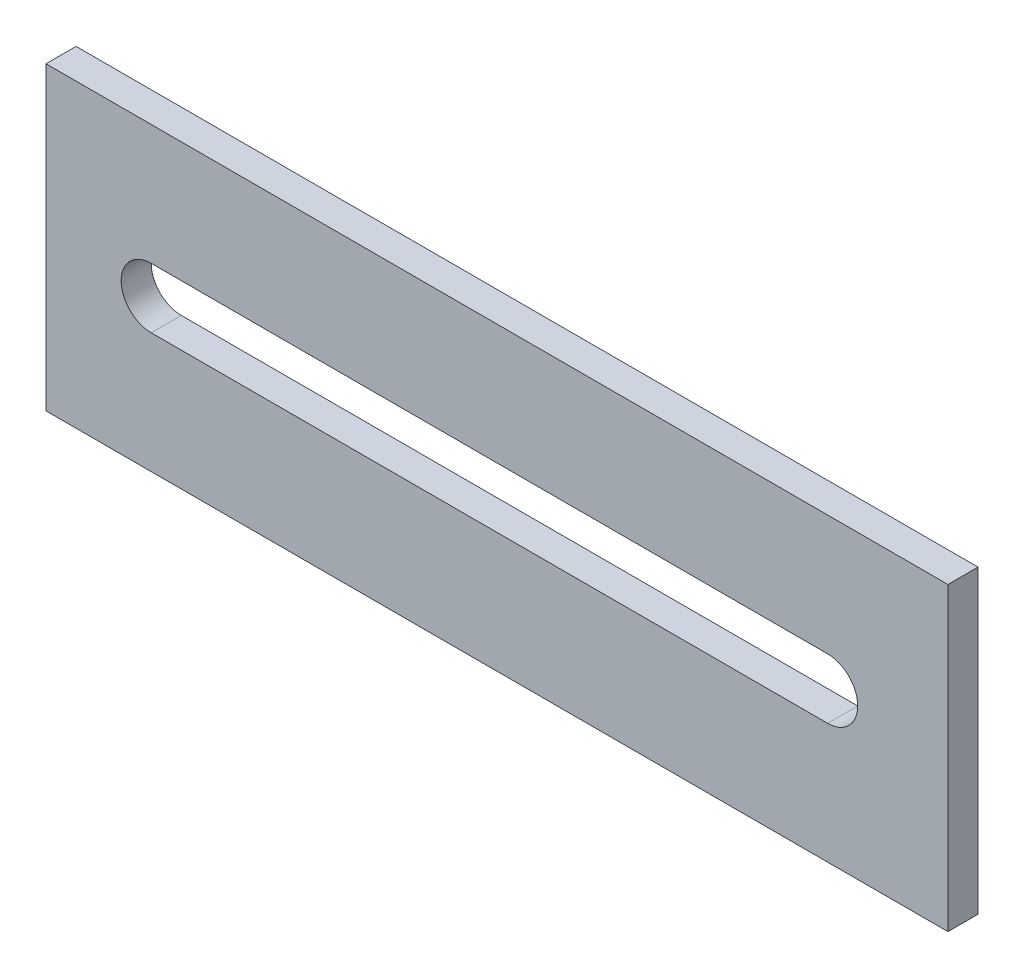
ISO-10303-21;
HEADER;
FILE_DESCRIPTION(('STEP AP214'),'2;1');
FILE_NAME('part.step','',(''),(''),'','','');
FILE_SCHEMA(('AUTOMOTIVE_DESIGN { 1 0 10303 214 1 1 1 1 }'));
ENDSEC;
DATA;
#1=APPLICATION_CONTEXT('core data for automotive mechanical design processes');
#2=APPLICATION_PROTOCOL_DEFINITION('international standard','automotive_design',2000,#1);
#3=PRODUCT_CONTEXT('',#1,'mechanical');
#4=PRODUCT('Part','Part','',(#3));
#5=PRODUCT_RELATED_PRODUCT_CATEGORY('part','',(#4));
#6=PRODUCT_DEFINITION_FORMATION('','',#4);
#7=PRODUCT_DEFINITION_CONTEXT('part definition',#1,'design');
#8=PRODUCT_DEFINITION('design','',#6,#7);
#9=PRODUCT_DEFINITION_SHAPE('','',#8);
#10=(LENGTH_UNIT() NAMED_UNIT(*) SI_UNIT(.MILLI.,.METRE.));
#11=(NAMED_UNIT(*) PLANE_ANGLE_UNIT() SI_UNIT($,.RADIAN.));
#12=(NAMED_UNIT(*) SI_UNIT($,.STERADIAN.) SOLID_ANGLE_UNIT());
#13=UNCERTAINTY_MEASURE_WITH_UNIT(LENGTH_MEASURE(1.E-05),#10,'distance_accuracy_value','');
#14=(GEOMETRIC_REPRESENTATION_CONTEXT(3) GLOBAL_UNCERTAINTY_ASSIGNED_CONTEXT((#13)) GLOBAL_UNIT_ASSIGNED_CONTEXT((#10,
#11,#12)) REPRESENTATION_CONTEXT('',''));
#15=CARTESIAN_POINT('',(0.,0.,0.));
#16=DIRECTION('',(0.,0.,1.));
#17=DIRECTION('',(1.,0.,0.));
#18=AXIS2_PLACEMENT_3D('',#15,#16,#17);
#19=CARTESIAN_POINT('',(30.,10.,2.));
#20=DIRECTION('',(-1.,0.,0.));
#21=DIRECTION('',(0.,0.,1.));
#22=AXIS2_PLACEMENT_3D('',#19,#20,#21);
#23=PLANE('',#22);
#24=DIRECTION('',(0.,1.,0.));
#25=VECTOR('',#24,1.);
#26=CARTESIAN_POINT('',(30.,10.,0.));
#27=LINE('',#26,#25);
#28=CARTESIAN_POINT('',(30.,-10.,0.));
#29=VERTEX_POINT('',#28);
#30=CARTESIAN_POINT('',(30.,10.,0.));
#31=VERTEX_POINT('',#30);
#32=EDGE_CURVE('E133',#29,#31,#27,.T.);
#33=ORIENTED_EDGE('',*,*,#32,.T.);
#34=DIRECTION('',(0.,0.,-1.));
#35=VECTOR('',#34,1.);
#36=CARTESIAN_POINT('',(30.,10.,2.));
#37=LINE('',#36,#35);
#38=CARTESIAN_POINT('',(30.,10.,2.));
#39=VERTEX_POINT('',#38);
#40=EDGE_CURVE('E11',#39,#31,#37,.T.);
#41=ORIENTED_EDGE('',*,*,#40,.F.);
#42=DIRECTION('',(0.,1.,0.));
#43=VECTOR('',#42,1.);
#44=CARTESIAN_POINT('',(30.,10.,2.));
#45=LINE('',#44,#43);
#46=CARTESIAN_POINT('',(30.,-10.,2.));
#47=VERTEX_POINT('',#46);
#48=EDGE_CURVE('E137',#47,#39,#45,.T.);
#49=ORIENTED_EDGE('',*,*,#48,.F.);
#50=DIRECTION('',(0.,0.,-1.));
#51=VECTOR('',#50,1.);
#52=CARTESIAN_POINT('',(30.,-10.,2.));
#53=LINE('',#52,#51);
#54=EDGE_CURVE('E147',#47,#29,#53,.T.);
#55=ORIENTED_EDGE('',*,*,#54,.T.);
#56=EDGE_LOOP('',(#33,#41,#49,#55));
#57=FACE_BOUND('',#56,.T.);
#58=ADVANCED_FACE('F36',(#57),#23,.F.);
#59=CARTESIAN_POINT('',(-30.,10.,2.));
#60=DIRECTION('',(0.,-1.,0.));
#61=DIRECTION('',(0.,0.,-1.));
#62=AXIS2_PLACEMENT_3D('',#59,#60,#61);
#63=PLANE('',#62);
#64=DIRECTION('',(-1.,0.,0.));
#65=VECTOR('',#64,1.);
#66=CARTESIAN_POINT('',(-30.,10.,0.));
#67=LINE('',#66,#65);
#68=CARTESIAN_POINT('',(-30.,10.,0.));
#69=VERTEX_POINT('',#68);
#70=EDGE_CURVE('E150',#31,#69,#67,.T.);
#71=ORIENTED_EDGE('',*,*,#70,.T.);
#72=DIRECTION('',(0.,0.,-1.));
#73=VECTOR('',#72,1.);
#74=CARTESIAN_POINT('',(-30.,10.,2.));
#75=LINE('',#74,#73);
#76=CARTESIAN_POINT('',(-30.,10.,2.));
#77=VERTEX_POINT('',#76);
#78=EDGE_CURVE('E43',#77,#69,#75,.T.);
#79=ORIENTED_EDGE('',*,*,#78,.F.);
#80=DIRECTION('',(-1.,0.,0.));
#81=VECTOR('',#80,1.);
#82=CARTESIAN_POINT('',(-30.,10.,2.));
#83=LINE('',#82,#81);
#84=EDGE_CURVE('E140',#39,#77,#83,.T.);
#85=ORIENTED_EDGE('',*,*,#84,.F.);
#86=ORIENTED_EDGE('',*,*,#40,.T.);
#87=EDGE_LOOP('',(#71,#79,#85,#86));
#88=FACE_BOUND('',#87,.T.);
#89=ADVANCED_FACE('F178',(#88),#63,.F.);
#90=CARTESIAN_POINT('',(-30.,10.,2.));
#91=DIRECTION('',(1.,0.,0.));
#92=DIRECTION('',(0.,1.,0.));
#93=AXIS2_PLACEMENT_3D('',#90,#91,#92);
#94=PLANE('',#93);
#95=DIRECTION('',(0.,-1.,0.));
#96=VECTOR('',#95,1.);
#97=CARTESIAN_POINT('',(-30.,10.,0.));
#98=LINE('',#97,#96);
#99=CARTESIAN_POINT('',(-30.,-10.,0.));
#100=VERTEX_POINT('',#99);
#101=EDGE_CURVE('E152',#69,#100,#98,.T.);
#102=ORIENTED_EDGE('',*,*,#101,.T.);
#103=DIRECTION('',(0.,0.,-1.));
#104=VECTOR('',#103,1.);
#105=CARTESIAN_POINT('',(-30.,-10.,2.));
#106=LINE('',#105,#104);
#107=CARTESIAN_POINT('',(-30.,-10.,2.));
#108=VERTEX_POINT('',#107);
#109=EDGE_CURVE('E157',#108,#100,#106,.T.);
#110=ORIENTED_EDGE('',*,*,#109,.F.);
#111=DIRECTION('',(0.,-1.,0.));
#112=VECTOR('',#111,1.);
#113=CARTESIAN_POINT('',(-30.,10.,2.));
#114=LINE('',#113,#112);
#115=EDGE_CURVE('E143',#77,#108,#114,.T.);
#116=ORIENTED_EDGE('',*,*,#115,.F.);
#117=ORIENTED_EDGE('',*,*,#78,.T.);
#118=EDGE_LOOP('',(#102,#110,#116,#117));
#119=FACE_BOUND('',#118,.T.);
#120=ADVANCED_FACE('F164',(#119),#94,.F.);
#121=CARTESIAN_POINT('',(-30.,-10.,2.));
#122=DIRECTION('',(0.,1.,0.));
#123=DIRECTION('',(0.,0.,1.));
#124=AXIS2_PLACEMENT_3D('',#121,#122,#123);
#125=PLANE('',#124);
#126=DIRECTION('',(1.,0.,0.));
#127=VECTOR('',#126,1.);
#128=CARTESIAN_POINT('',(-30.,-10.,0.));
#129=LINE('',#128,#127);
#130=EDGE_CURVE('E141',#100,#29,#129,.T.);
#131=ORIENTED_EDGE('',*,*,#130,.T.);
#132=ORIENTED_EDGE('',*,*,#54,.F.);
#133=DIRECTION('',(1.,0.,0.));
#134=VECTOR('',#133,1.);
#135=CARTESIAN_POINT('',(-30.,-10.,2.));
#136=LINE('',#135,#134);
#137=EDGE_CURVE('E145',#108,#47,#136,.T.);
#138=ORIENTED_EDGE('',*,*,#137,.F.);
#139=ORIENTED_EDGE('',*,*,#109,.T.);
#140=EDGE_LOOP('',(#131,#132,#138,#139));
#141=FACE_BOUND('',#140,.T.);
#142=ADVANCED_FACE('F171',(#141),#125,.F.);
#143=CARTESIAN_POINT('',(0.,0.,2.));
#144=DIRECTION('',(0.,0.,1.));
#145=DIRECTION('',(1.,0.,0.));
#146=AXIS2_PLACEMENT_3D('',#143,#144,#145);
#147=PLANE('',#146);
#148=CARTESIAN_POINT('',(-23.,0.,2.));
#149=DIRECTION('',(0.,0.,1.));
#150=DIRECTION('',(1.,0.,0.));
#151=AXIS2_PLACEMENT_3D('',#148,#149,#150);
#152=CIRCLE('',#151,2.);
#153=CARTESIAN_POINT('',(-23.,2.,2.));
#154=VERTEX_POINT('',#153);
#155=CARTESIAN_POINT('',(-23.,-2.,2.));
#156=VERTEX_POINT('',#155);
#157=EDGE_CURVE('E50',#154,#156,#152,.T.);
#158=ORIENTED_EDGE('',*,*,#157,.F.);
#159=DIRECTION('',(-1.,0.,0.));
#160=VECTOR('',#159,1.);
#161=CARTESIAN_POINT('',(-23.,2.,2.));
#162=LINE('',#161,#160);
#163=CARTESIAN_POINT('',(22.,2.,2.));
#164=VERTEX_POINT('',#163);
#165=EDGE_CURVE('E118',#164,#154,#162,.T.);
#166=ORIENTED_EDGE('',*,*,#165,.F.);
#167=CARTESIAN_POINT('',(22.,0.,2.));
#168=DIRECTION('',(0.,0.,1.));
#169=DIRECTION('',(1.,0.,0.));
#170=AXIS2_PLACEMENT_3D('',#167,#168,#169);
#171=CIRCLE('',#170,2.);
#172=CARTESIAN_POINT('',(22.,-2.,2.));
#173=VERTEX_POINT('',#172);
#174=EDGE_CURVE('E121',#173,#164,#171,.T.);
#175=ORIENTED_EDGE('',*,*,#174,.F.);
#176=DIRECTION('',(1.,0.,0.));
#177=VECTOR('',#176,1.);
#178=CARTESIAN_POINT('',(-23.,-2.,2.));
#179=LINE('',#178,#177);
#180=EDGE_CURVE('E127',#156,#173,#179,.T.);
#181=ORIENTED_EDGE('',*,*,#180,.F.);
#182=EDGE_LOOP('',(#158,#166,#175,#181));
#183=FACE_BOUND('',#182,.T.);
#184=ORIENTED_EDGE('',*,*,#48,.T.);
#185=ORIENTED_EDGE('',*,*,#84,.T.);
#186=ORIENTED_EDGE('',*,*,#115,.T.);
#187=ORIENTED_EDGE('',*,*,#137,.T.);
#188=EDGE_LOOP('',(#184,#185,#186,#187));
#189=FACE_BOUND('',#188,.T.);
#190=ADVANCED_FACE('F177',(#183,#189),#147,.T.);
#191=CARTESIAN_POINT('',(0.,0.,0.));
#192=DIRECTION('',(0.,0.,1.));
#193=DIRECTION('',(1.,0.,0.));
#194=AXIS2_PLACEMENT_3D('',#191,#192,#193);
#195=PLANE('',#194);
#196=DIRECTION('',(-1.,0.,0.));
#197=VECTOR('',#196,1.);
#198=CARTESIAN_POINT('',(-23.,2.,0.));
#199=LINE('',#198,#197);
#200=CARTESIAN_POINT('',(22.,2.,0.));
#201=VERTEX_POINT('',#200);
#202=CARTESIAN_POINT('',(-23.,2.,0.));
#203=VERTEX_POINT('',#202);
#204=EDGE_CURVE('E108',#201,#203,#199,.T.);
#205=ORIENTED_EDGE('',*,*,#204,.T.);
#206=CARTESIAN_POINT('',(-23.,0.,0.));
#207=DIRECTION('',(0.,0.,1.));
#208=DIRECTION('',(1.,0.,0.));
#209=AXIS2_PLACEMENT_3D('',#206,#207,#208);
#210=CIRCLE('',#209,2.);
#211=CARTESIAN_POINT('',(-23.,-2.,0.));
#212=VERTEX_POINT('',#211);
#213=EDGE_CURVE('E102',#203,#212,#210,.T.);
#214=ORIENTED_EDGE('',*,*,#213,.T.);
#215=DIRECTION('',(1.,0.,0.));
#216=VECTOR('',#215,1.);
#217=CARTESIAN_POINT('',(-23.,-2.,0.));
#218=LINE('',#217,#216);
#219=CARTESIAN_POINT('',(22.,-2.,0.));
#220=VERTEX_POINT('',#219);
#221=EDGE_CURVE('E111',#212,#220,#218,.T.);
#222=ORIENTED_EDGE('',*,*,#221,.T.);
#223=CARTESIAN_POINT('',(22.,0.,0.));
#224=DIRECTION('',(0.,0.,1.));
#225=DIRECTION('',(1.,0.,0.));
#226=AXIS2_PLACEMENT_3D('',#223,#224,#225);
#227=CIRCLE('',#226,2.);
#228=EDGE_CURVE('E58',#220,#201,#227,.T.);
#229=ORIENTED_EDGE('',*,*,#228,.T.);
#230=EDGE_LOOP('',(#205,#214,#222,#229));
#231=FACE_BOUND('',#230,.T.);
#232=ORIENTED_EDGE('',*,*,#32,.F.);
#233=ORIENTED_EDGE('',*,*,#130,.F.);
#234=ORIENTED_EDGE('',*,*,#101,.F.);
#235=ORIENTED_EDGE('',*,*,#70,.F.);
#236=EDGE_LOOP('',(#232,#233,#234,#235));
#237=FACE_BOUND('',#236,.T.);
#238=ADVANCED_FACE('F115',(#231,#237),#195,.F.);
#239=CARTESIAN_POINT('',(-23.,0.,0.));
#240=DIRECTION('',(0.,0.,1.));
#241=DIRECTION('',(1.,0.,0.));
#242=AXIS2_PLACEMENT_3D('',#239,#240,#241);
#243=CYLINDRICAL_SURFACE('',#242,2.);
#244=ORIENTED_EDGE('',*,*,#157,.T.);
#245=DIRECTION('',(0.,0.,1.));
#246=VECTOR('',#245,1.);
#247=CARTESIAN_POINT('',(-23.,-2.,0.));
#248=LINE('',#247,#246);
#249=EDGE_CURVE('E98',#212,#156,#248,.T.);
#250=ORIENTED_EDGE('',*,*,#249,.F.);
#251=ORIENTED_EDGE('',*,*,#213,.F.);
#252=DIRECTION('',(0.,0.,1.));
#253=VECTOR('',#252,1.);
#254=CARTESIAN_POINT('',(-23.,2.,0.));
#255=LINE('',#254,#253);
#256=EDGE_CURVE('E131',#203,#154,#255,.T.);
#257=ORIENTED_EDGE('',*,*,#256,.T.);
#258=EDGE_LOOP('',(#244,#250,#251,#257));
#259=FACE_BOUND('',#258,.T.);
#260=ADVANCED_FACE('F100',(#259),#243,.F.);
#261=CARTESIAN_POINT('',(-23.,2.,0.));
#262=DIRECTION('',(0.,1.,0.));
#263=DIRECTION('',(0.,0.,1.));
#264=AXIS2_PLACEMENT_3D('',#261,#262,#263);
#265=PLANE('',#264);
#266=ORIENTED_EDGE('',*,*,#165,.T.);
#267=ORIENTED_EDGE('',*,*,#256,.F.);
#268=ORIENTED_EDGE('',*,*,#204,.F.);
#269=DIRECTION('',(0.,0.,1.));
#270=VECTOR('',#269,1.);
#271=CARTESIAN_POINT('',(22.,2.,0.));
#272=LINE('',#271,#270);
#273=EDGE_CURVE('E134',#201,#164,#272,.T.);
#274=ORIENTED_EDGE('',*,*,#273,.T.);
#275=EDGE_LOOP('',(#266,#267,#268,#274));
#276=FACE_BOUND('',#275,.T.);
#277=ADVANCED_FACE('F195',(#276),#265,.F.);
#278=CARTESIAN_POINT('',(22.,0.,0.));
#279=DIRECTION('',(0.,0.,1.));
#280=DIRECTION('',(1.,0.,0.));
#281=AXIS2_PLACEMENT_3D('',#278,#279,#280);
#282=CYLINDRICAL_SURFACE('',#281,2.);
#283=ORIENTED_EDGE('',*,*,#174,.T.);
#284=ORIENTED_EDGE('',*,*,#273,.F.);
#285=ORIENTED_EDGE('',*,*,#228,.F.);
#286=DIRECTION('',(0.,0.,1.));
#287=VECTOR('',#286,1.);
#288=CARTESIAN_POINT('',(22.,-2.,0.));
#289=LINE('',#288,#287);
#290=EDGE_CURVE('E107',#220,#173,#289,.T.);
#291=ORIENTED_EDGE('',*,*,#290,.T.);
#292=EDGE_LOOP('',(#283,#284,#285,#291));
#293=FACE_BOUND('',#292,.T.);
#294=ADVANCED_FACE('F198',(#293),#282,.F.);
#295=CARTESIAN_POINT('',(-23.,-2.,0.));
#296=DIRECTION('',(0.,-1.,0.));
#297=DIRECTION('',(0.,0.,-1.));
#298=AXIS2_PLACEMENT_3D('',#295,#296,#297);
#299=PLANE('',#298);
#300=ORIENTED_EDGE('',*,*,#180,.T.);
#301=ORIENTED_EDGE('',*,*,#290,.F.);
#302=ORIENTED_EDGE('',*,*,#221,.F.);
#303=ORIENTED_EDGE('',*,*,#249,.T.);
#304=EDGE_LOOP('',(#300,#301,#302,#303));
#305=FACE_BOUND('',#304,.T.);
#306=ADVANCED_FACE('F112',(#305),#299,.F.);
#307=CLOSED_SHELL('',(#58,#89,#120,#142,#190,#238,#260,#277,#294,#306));
#308=MANIFOLD_SOLID_BREP('B2',#307);
#309=ADVANCED_BREP_SHAPE_REPRESENTATION('',(#18,#308),#14);
#310=SHAPE_DEFINITION_REPRESENTATION(#9,#309);
ENDSEC;
END-ISO-10303-21;
